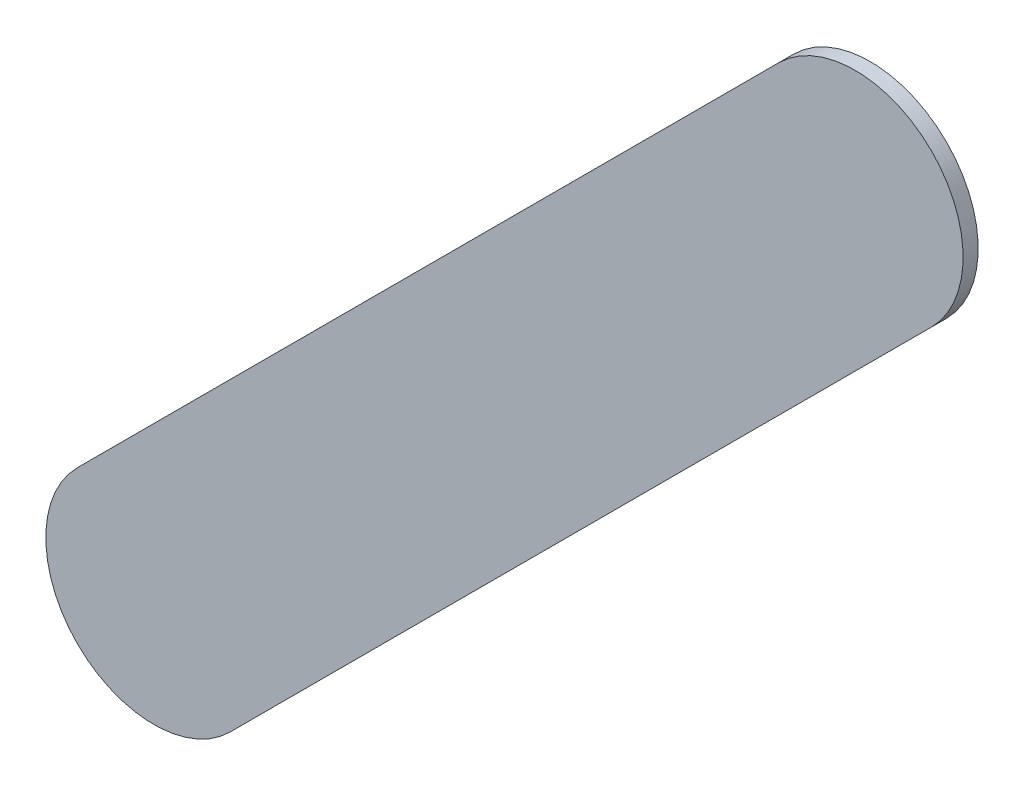
ISO-10303-21;
HEADER;
FILE_DESCRIPTION(('STEP AP214'),'2;1');
FILE_NAME('part.step','',(''),(''),'','','');
FILE_SCHEMA(('AUTOMOTIVE_DESIGN { 1 0 10303 214 1 1 1 1 }'));
ENDSEC;
DATA;
#1=APPLICATION_CONTEXT('core data for automotive mechanical design processes');
#2=APPLICATION_PROTOCOL_DEFINITION('international standard','automotive_design',2000,#1);
#3=PRODUCT_CONTEXT('',#1,'mechanical');
#4=PRODUCT('Part','Part','',(#3));
#5=PRODUCT_RELATED_PRODUCT_CATEGORY('part','',(#4));
#6=PRODUCT_DEFINITION_FORMATION('','',#4);
#7=PRODUCT_DEFINITION_CONTEXT('part definition',#1,'design');
#8=PRODUCT_DEFINITION('design','',#6,#7);
#9=PRODUCT_DEFINITION_SHAPE('','',#8);
#10=(LENGTH_UNIT() NAMED_UNIT(*) SI_UNIT(.MILLI.,.METRE.));
#11=(NAMED_UNIT(*) PLANE_ANGLE_UNIT() SI_UNIT($,.RADIAN.));
#12=(NAMED_UNIT(*) SI_UNIT($,.STERADIAN.) SOLID_ANGLE_UNIT());
#13=UNCERTAINTY_MEASURE_WITH_UNIT(LENGTH_MEASURE(1.E-05),#10,'distance_accuracy_value','');
#14=(GEOMETRIC_REPRESENTATION_CONTEXT(3) GLOBAL_UNCERTAINTY_ASSIGNED_CONTEXT((#13)) GLOBAL_UNIT_ASSIGNED_CONTEXT((#10,
#11,#12)) REPRESENTATION_CONTEXT('',''));
#15=CARTESIAN_POINT('',(0.,0.,0.));
#16=DIRECTION('',(0.,0.,1.));
#17=DIRECTION('',(1.,0.,0.));
#18=AXIS2_PLACEMENT_3D('',#15,#16,#17);
#19=CARTESIAN_POINT('',(104.442275,-57.111277,1.635));
#20=DIRECTION('',(0.,0.,1.));
#21=DIRECTION('',(1.,0.,0.));
#22=AXIS2_PLACEMENT_3D('',#19,#20,#21);
#23=PLANE('',#22);
#24=DIRECTION('',(0.707106781186548,0.707106781186548,0.));
#25=VECTOR('',#24,1.);
#26=CARTESIAN_POINT('',(104.442275,-57.111277,1.635));
#27=LINE('',#26,#25);
#28=CARTESIAN_POINT('',(104.442275,-57.111277,1.635));
#29=VERTEX_POINT('',#28);
#30=CARTESIAN_POINT('',(106.066776,-55.486776,1.635));
#31=VERTEX_POINT('',#30);
#32=EDGE_CURVE('E81',#29,#31,#27,.T.);
#33=ORIENTED_EDGE('',*,*,#32,.T.);
#34=CARTESIAN_POINT('',(105.8899995,-55.3099995,1.635));
#35=DIRECTION('',(0.,0.,1.));
#36=DIRECTION('',(0.707106781186548,-0.707106781186548,0.));
#37=AXIS2_PLACEMENT_3D('',#34,#35,#36);
#38=CIRCLE('',#37,0.249999723809);
#39=CARTESIAN_POINT('',(105.713223,-55.133223,1.635));
#40=VERTEX_POINT('',#39);
#41=EDGE_CURVE('E102',#31,#40,#38,.T.);
#42=ORIENTED_EDGE('',*,*,#41,.T.);
#43=DIRECTION('',(-0.707106781186548,-0.707106781186548,0.));
#44=VECTOR('',#43,1.);
#45=CARTESIAN_POINT('',(105.713223,-55.133223,1.635));
#46=LINE('',#45,#44);
#47=CARTESIAN_POINT('',(104.088722,-56.757724,1.635));
#48=VERTEX_POINT('',#47);
#49=EDGE_CURVE('E74',#40,#48,#46,.T.);
#50=ORIENTED_EDGE('',*,*,#49,.T.);
#51=CARTESIAN_POINT('',(104.2654985,-56.9345005,1.635));
#52=DIRECTION('',(0.,0.,1.));
#53=DIRECTION('',(-0.707106781186548,0.707106781186548,0.));
#54=AXIS2_PLACEMENT_3D('',#51,#52,#53);
#55=CIRCLE('',#54,0.249999723809);
#56=EDGE_CURVE('E11',#48,#29,#55,.T.);
#57=ORIENTED_EDGE('',*,*,#56,.T.);
#58=EDGE_LOOP('',(#33,#42,#50,#57));
#59=FACE_BOUND('',#58,.T.);
#60=ADVANCED_FACE('F17',(#59),#23,.T.);
#61=CARTESIAN_POINT('',(104.442275,-57.111277,1.6));
#62=DIRECTION('',(0.,0.,1.));
#63=DIRECTION('',(1.,0.,0.));
#64=AXIS2_PLACEMENT_3D('',#61,#62,#63);
#65=PLANE('',#64);
#66=CARTESIAN_POINT('',(104.2654985,-56.9345005,1.6));
#67=DIRECTION('',(0.,0.,1.));
#68=DIRECTION('',(-0.707106781186548,0.707106781186548,0.));
#69=AXIS2_PLACEMENT_3D('',#66,#67,#68);
#70=CIRCLE('',#69,0.249999723809);
#71=CARTESIAN_POINT('',(104.088722,-56.757724,1.6));
#72=VERTEX_POINT('',#71);
#73=CARTESIAN_POINT('',(104.442275,-57.111277,1.6));
#74=VERTEX_POINT('',#73);
#75=EDGE_CURVE('E26',#72,#74,#70,.T.);
#76=ORIENTED_EDGE('',*,*,#75,.F.);
#77=DIRECTION('',(-0.707106781186548,-0.707106781186548,0.));
#78=VECTOR('',#77,1.);
#79=CARTESIAN_POINT('',(105.713223,-55.133223,1.6));
#80=LINE('',#79,#78);
#81=CARTESIAN_POINT('',(105.713223,-55.133223,1.6));
#82=VERTEX_POINT('',#81);
#83=EDGE_CURVE('E110',#82,#72,#80,.T.);
#84=ORIENTED_EDGE('',*,*,#83,.F.);
#85=CARTESIAN_POINT('',(105.8899995,-55.3099995,1.6));
#86=DIRECTION('',(0.,0.,1.));
#87=DIRECTION('',(0.707106781186548,-0.707106781186548,0.));
#88=AXIS2_PLACEMENT_3D('',#85,#86,#87);
#89=CIRCLE('',#88,0.249999723809);
#90=CARTESIAN_POINT('',(106.066776,-55.486776,1.6));
#91=VERTEX_POINT('',#90);
#92=EDGE_CURVE('E83',#91,#82,#89,.T.);
#93=ORIENTED_EDGE('',*,*,#92,.F.);
#94=DIRECTION('',(0.707106781186548,0.707106781186548,0.));
#95=VECTOR('',#94,1.);
#96=CARTESIAN_POINT('',(104.442275,-57.111277,1.6));
#97=LINE('',#96,#95);
#98=EDGE_CURVE('E79',#74,#91,#97,.T.);
#99=ORIENTED_EDGE('',*,*,#98,.F.);
#100=EDGE_LOOP('',(#76,#84,#93,#99));
#101=FACE_BOUND('',#100,.T.);
#102=ADVANCED_FACE('F85',(#101),#65,.F.);
#103=CARTESIAN_POINT('',(104.2654985,-56.9345005,1.6));
#104=DIRECTION('',(0.,0.,-1.));
#105=DIRECTION('',(-0.707106781186548,0.707106781186548,0.));
#106=AXIS2_PLACEMENT_3D('',#103,#104,#105);
#107=CYLINDRICAL_SURFACE('',#106,0.249999723809);
#108=ORIENTED_EDGE('',*,*,#75,.T.);
#109=DIRECTION('',(0.,0.,1.));
#110=VECTOR('',#109,1.);
#111=CARTESIAN_POINT('',(104.442275,-57.111277,1.6));
#112=LINE('',#111,#110);
#113=EDGE_CURVE('E68',#74,#29,#112,.T.);
#114=ORIENTED_EDGE('',*,*,#113,.T.);
#115=ORIENTED_EDGE('',*,*,#56,.F.);
#116=DIRECTION('',(0.,0.,1.));
#117=VECTOR('',#116,1.);
#118=CARTESIAN_POINT('',(104.088722,-56.757724,1.6));
#119=LINE('',#118,#117);
#120=EDGE_CURVE('E71',#72,#48,#119,.T.);
#121=ORIENTED_EDGE('',*,*,#120,.F.);
#122=EDGE_LOOP('',(#108,#114,#115,#121));
#123=FACE_BOUND('',#122,.T.);
#124=ADVANCED_FACE('F19',(#123),#107,.T.);
#125=CARTESIAN_POINT('',(105.713223,-55.133223,1.6));
#126=DIRECTION('',(0.707106781186548,-0.707106781186548,0.));
#127=DIRECTION('',(0.,0.,-1.));
#128=AXIS2_PLACEMENT_3D('',#125,#126,#127);
#129=PLANE('',#128);
#130=ORIENTED_EDGE('',*,*,#83,.T.);
#131=ORIENTED_EDGE('',*,*,#120,.T.);
#132=ORIENTED_EDGE('',*,*,#49,.F.);
#133=DIRECTION('',(0.,0.,1.));
#134=VECTOR('',#133,1.);
#135=CARTESIAN_POINT('',(105.713223,-55.133223,1.6));
#136=LINE('',#135,#134);
#137=EDGE_CURVE('E98',#82,#40,#136,.T.);
#138=ORIENTED_EDGE('',*,*,#137,.F.);
#139=EDGE_LOOP('',(#130,#131,#132,#138));
#140=FACE_BOUND('',#139,.T.);
#141=ADVANCED_FACE('F121',(#140),#129,.F.);
#142=CARTESIAN_POINT('',(105.8899995,-55.3099995,1.6));
#143=DIRECTION('',(0.,0.,-1.));
#144=DIRECTION('',(0.707106781186548,-0.707106781186548,0.));
#145=AXIS2_PLACEMENT_3D('',#142,#143,#144);
#146=CYLINDRICAL_SURFACE('',#145,0.249999723809);
#147=ORIENTED_EDGE('',*,*,#92,.T.);
#148=ORIENTED_EDGE('',*,*,#137,.T.);
#149=ORIENTED_EDGE('',*,*,#41,.F.);
#150=DIRECTION('',(0.,0.,1.));
#151=VECTOR('',#150,1.);
#152=CARTESIAN_POINT('',(106.066776,-55.486776,1.6));
#153=LINE('',#152,#151);
#154=EDGE_CURVE('E89',#91,#31,#153,.T.);
#155=ORIENTED_EDGE('',*,*,#154,.F.);
#156=EDGE_LOOP('',(#147,#148,#149,#155));
#157=FACE_BOUND('',#156,.T.);
#158=ADVANCED_FACE('F124',(#157),#146,.T.);
#159=CARTESIAN_POINT('',(104.442275,-57.111277,1.6));
#160=DIRECTION('',(-0.707106781186548,0.707106781186548,0.));
#161=DIRECTION('',(0.,0.,1.));
#162=AXIS2_PLACEMENT_3D('',#159,#160,#161);
#163=PLANE('',#162);
#164=ORIENTED_EDGE('',*,*,#98,.T.);
#165=ORIENTED_EDGE('',*,*,#154,.T.);
#166=ORIENTED_EDGE('',*,*,#32,.F.);
#167=ORIENTED_EDGE('',*,*,#113,.F.);
#168=EDGE_LOOP('',(#164,#165,#166,#167));
#169=FACE_BOUND('',#168,.T.);
#170=ADVANCED_FACE('F77',(#169),#163,.F.);
#171=CLOSED_SHELL('',(#60,#102,#124,#141,#158,#170));
#172=MANIFOLD_SOLID_BREP('B1',#171);
#173=ADVANCED_BREP_SHAPE_REPRESENTATION('',(#18,#172),#14);
#174=SHAPE_DEFINITION_REPRESENTATION(#9,#173);
ENDSEC;
END-ISO-10303-21;
